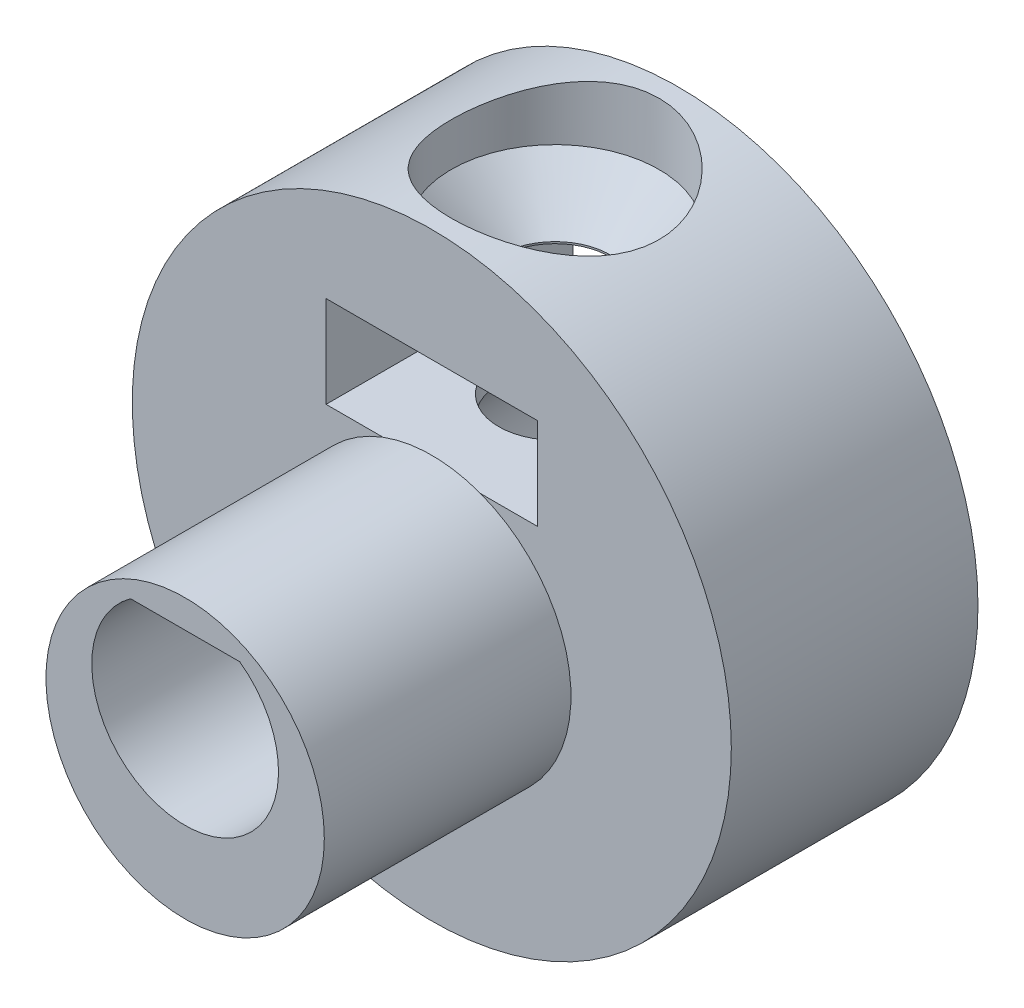
ISO-10303-21;
HEADER;
FILE_DESCRIPTION(('STEP AP214'),'2;1');
FILE_NAME('part.step','',(''),(''),'','','');
FILE_SCHEMA(('AUTOMOTIVE_DESIGN { 1 0 10303 214 1 1 1 1 }'));
ENDSEC;
DATA;
#1=APPLICATION_CONTEXT('core data for automotive mechanical design processes');
#2=APPLICATION_PROTOCOL_DEFINITION('international standard','automotive_design',2000,#1);
#3=PRODUCT_CONTEXT('',#1,'mechanical');
#4=PRODUCT('Part','Part','',(#3));
#5=PRODUCT_RELATED_PRODUCT_CATEGORY('part','',(#4));
#6=PRODUCT_DEFINITION_FORMATION('','',#4);
#7=PRODUCT_DEFINITION_CONTEXT('part definition',#1,'design');
#8=PRODUCT_DEFINITION('design','',#6,#7);
#9=PRODUCT_DEFINITION_SHAPE('','',#8);
#10=(LENGTH_UNIT() NAMED_UNIT(*) SI_UNIT(.MILLI.,.METRE.));
#11=(NAMED_UNIT(*) PLANE_ANGLE_UNIT() SI_UNIT($,.RADIAN.));
#12=(NAMED_UNIT(*) SI_UNIT($,.STERADIAN.) SOLID_ANGLE_UNIT());
#13=UNCERTAINTY_MEASURE_WITH_UNIT(LENGTH_MEASURE(1.E-05),#10,'distance_accuracy_value','');
#14=(GEOMETRIC_REPRESENTATION_CONTEXT(3) GLOBAL_UNCERTAINTY_ASSIGNED_CONTEXT((#13)) GLOBAL_UNIT_ASSIGNED_CONTEXT((#10,
#11,#12)) REPRESENTATION_CONTEXT('',''));
#15=CARTESIAN_POINT('',(0.,0.,0.));
#16=DIRECTION('',(0.,0.,1.));
#17=DIRECTION('',(1.,0.,0.));
#18=AXIS2_PLACEMENT_3D('',#15,#16,#17);
#19=CARTESIAN_POINT('',(0.,0.,7.));
#20=DIRECTION('',(0.,0.,-1.));
#21=DIRECTION('',(-1.,0.,0.));
#22=AXIS2_PLACEMENT_3D('',#19,#20,#21);
#23=CYLINDRICAL_SURFACE('',#22,8.5);
#24=CARTESIAN_POINT('',(0.,0.,7.));
#25=DIRECTION('',(0.,0.,1.));
#26=DIRECTION('',(1.,0.,0.));
#27=AXIS2_PLACEMENT_3D('',#24,#25,#26);
#28=CIRCLE('',#27,8.5);
#29=CARTESIAN_POINT('',(8.5,0.,7.));
#30=VERTEX_POINT('',#29);
#31=EDGE_CURVE('E272',#30,#30,#28,.T.);
#32=ORIENTED_EDGE('',*,*,#31,.F.);
#33=EDGE_LOOP('',(#32));
#34=FACE_BOUND('',#33,.T.);
#35=CARTESIAN_POINT('',(0.,0.,0.));
#36=DIRECTION('',(0.,0.,1.));
#37=DIRECTION('',(1.,0.,0.));
#38=AXIS2_PLACEMENT_3D('',#35,#36,#37);
#39=CIRCLE('',#38,8.5);
#40=CARTESIAN_POINT('',(8.5,0.,0.));
#41=VERTEX_POINT('',#40);
#42=EDGE_CURVE('E266',#41,#41,#39,.T.);
#43=ORIENTED_EDGE('',*,*,#42,.T.);
#44=EDGE_LOOP('',(#43));
#45=FACE_BOUND('',#44,.T.);
#46=CARTESIAN_POINT('',(-2.4976566133076,8.12475916209218,5.06978069869673));
#47=CARTESIAN_POINT('',(-2.45319115247167,8.13842624372445,5.14052214784692));
#48=CARTESIAN_POINT('',(-2.40579379129014,8.15259906685285,5.20926792787036));
#49=CARTESIAN_POINT('',(-2.30541918353998,8.18155142551015,5.34241791198123));
#50=CARTESIAN_POINT('',(-2.25244214730842,8.19633093815584,5.40682227957694));
#51=CARTESIAN_POINT('',(-2.08559993364935,8.24096387551114,5.59296340845329));
#52=CARTESIAN_POINT('',(-1.96379293821466,8.27112157248585,5.70767691704536));
#53=CARTESIAN_POINT('',(-1.70636003995567,8.32797463190604,5.91184711282402));
#54=CARTESIAN_POINT('',(-1.57128592838729,8.35474881482083,6.001981892767));
#55=CARTESIAN_POINT('',(-1.28750137103305,8.40315485018163,6.15915511575892));
#56=CARTESIAN_POINT('',(-1.13879895604352,8.42478970443847,6.22620705151039));
#57=CARTESIAN_POINT('',(-0.831187937836323,8.46068191069057,6.33519131239508));
#58=CARTESIAN_POINT('',(-0.672256571938539,8.47492212101672,6.37706530718806));
#59=CARTESIAN_POINT('',(-0.349104402202425,8.4943684291606,6.43385731899328));
#60=CARTESIAN_POINT('',(-0.184884583871302,8.49957620037078,6.44878032909372));
#61=CARTESIAN_POINT('',(0.138015723993134,8.50036011208845,6.45103621336103));
#62=CARTESIAN_POINT('',(0.296689734672785,8.4962657088658,6.43931282000832));
#63=CARTESIAN_POINT('',(0.609739891194811,8.47955195455849,6.39064304040091));
#64=CARTESIAN_POINT('',(0.764113634581695,8.46692793384153,6.35368283786199));
#65=CARTESIAN_POINT('',(1.06375533887611,8.4345186012922,6.25603150933245));
#66=CARTESIAN_POINT('',(1.20905000683216,8.41475557760322,6.19541419459285));
#67=CARTESIAN_POINT('',(1.48731375058839,8.37004774740902,6.0524065686952));
#68=CARTESIAN_POINT('',(1.62030956781964,8.34511458458429,5.97006507104002));
#69=CARTESIAN_POINT('',(1.77519124725063,8.31261821534849,5.85638504059988));
#70=CARTESIAN_POINT('',(1.8043222672237,8.30634083738567,5.83415379011479));
#71=CARTESIAN_POINT('',(1.96343933734412,8.27119610111673,5.70795471337644));
#72=CARTESIAN_POINT('',(2.08511950406867,8.24108270241644,5.59342954668651));
#73=CARTESIAN_POINT('',(2.30774596317545,8.1815459992705,5.34519120906915));
#74=CARTESIAN_POINT('',(2.40863639693148,8.15212473740542,5.2114279425932));
#75=CARTESIAN_POINT('',(2.58236776313032,8.09871823066431,4.93498995802956));
#76=CARTESIAN_POINT('',(2.65633004978303,8.07453878944836,4.79306002253415));
#77=CARTESIAN_POINT('',(2.7805092495441,8.03262664641585,4.49839769507062));
#78=CARTESIAN_POINT('',(2.83074936112862,8.01488765027596,4.34567602537025));
#79=CARTESIAN_POINT('',(2.90591996981457,7.98794413403531,4.03295557266693));
#80=CARTESIAN_POINT('',(2.9307875433104,7.97876083684202,3.87293972081594));
#81=CARTESIAN_POINT('',(2.95398174635075,7.97020434608399,3.55072336269741));
#82=CARTESIAN_POINT('',(2.95230970967962,7.97083065952385,3.38852296662646));
#83=CARTESIAN_POINT('',(2.92298994582522,7.98162544091318,3.07214390352963));
#84=CARTESIAN_POINT('',(2.89618320404268,7.9914849607523,2.91787537801917));
#85=CARTESIAN_POINT('',(2.81878881465332,8.01910824594589,2.61614548479724));
#86=CARTESIAN_POINT('',(2.76819372913322,8.03687448340477,2.46868626200185));
#87=CARTESIAN_POINT('',(2.64374182838853,8.07867559451911,2.18164089371048));
#88=CARTESIAN_POINT('',(2.56947203344734,8.10282034535183,2.04225083932772));
#89=CARTESIAN_POINT('',(2.4000811737298,8.15459461002143,1.77756977114323));
#90=CARTESIAN_POINT('',(2.30497218991925,8.18222210090779,1.65227065192168));
#91=CARTESIAN_POINT('',(2.14444672038787,8.22525010429297,1.47244158886466));
#92=CARTESIAN_POINT('',(2.08555070125962,8.24041673348502,1.41191270278541));
#93=CARTESIAN_POINT('',(1.96287977928872,8.27049513310864,1.29621000389169));
#94=CARTESIAN_POINT('',(1.89911464567286,8.28540734404793,1.24102594733433));
#95=CARTESIAN_POINT('',(1.83303027798234,8.3,1.18861513373476));
#96=B_SPLINE_CURVE_WITH_KNOTS('',3,(#46,#47,#48,#49,#50,#51,#52,#53,#54,#55,#56,#57,#58,#59,#60,
#61,#62,#63,#64,#65,#66,#67,#68,#69,#70,#71,#72,#73,#74,#75,#76,#77,#78,#79,#80,#81,#82,#83,#84,
#85,#86,#87,#88,#89,#90,#91,#92,#93,#94,#95),.UNSPECIFIED.,.F.,.F.,(4,2,2,2,2,2,2,2,2,2,2,2,2,2,
2,2,2,2,2,2,2,2,2,2,4),(0.,0.253833285787019,0.507657006239854,1.01513132403204,
1.50672343842426,1.99802771074243,2.49046585733758,2.98281276276087,3.4579950628208,
3.93343771763219,4.40740867898813,4.88032358222269,4.99186106409764,5.49853142231878,
6.00654586378571,6.48996962093975,6.9729196424049,7.45706448441352,7.94118499513888,
8.40966421544493,8.87829001289202,9.35558437726861,9.83260277159268,10.0897481621581,
10.3463905361852),.UNSPECIFIED.);
#97=CARTESIAN_POINT('',(-1.83303027798234,8.3,5.81138486626524));
#98=VERTEX_POINT('',#97);
#99=CARTESIAN_POINT('',(1.83303027798234,8.3,1.18861513373476));
#100=VERTEX_POINT('',#99);
#101=EDGE_CURVE('E187',#98,#100,#96,.T.);
#102=ORIENTED_EDGE('',*,*,#101,.F.);
#103=CARTESIAN_POINT('',(2.4976566133076,8.12475916209218,1.93021930130327));
#104=CARTESIAN_POINT('',(2.45318994500136,8.13842662563914,1.85947588226206));
#105=CARTESIAN_POINT('',(2.40579116119691,8.15259985847907,1.79072823574639));
#106=CARTESIAN_POINT('',(2.30541346555239,8.18155304169366,1.6575748509336));
#107=CARTESIAN_POINT('',(2.25243477065462,8.19633296846693,1.5931689439928));
#108=CARTESIAN_POINT('',(2.08559334134924,8.24096552582563,1.40703032681757));
#109=CARTESIAN_POINT('',(1.96378968996023,8.27112236826603,1.2923202912556));
#110=CARTESIAN_POINT('',(1.70636391719496,8.32797369967156,1.08815617097751));
#111=CARTESIAN_POINT('',(1.57129368992825,8.35474701933418,0.998023916349741));
#112=CARTESIAN_POINT('',(1.28751241618149,8.40315343701242,0.840849493137524));
#113=CARTESIAN_POINT('',(1.1388084928932,8.42478919827129,0.773795353021942));
#114=CARTESIAN_POINT('',(0.827987048637116,8.4610547714335,0.663675633520592));
#115=CARTESIAN_POINT('',(0.665639156561353,8.47551136360076,0.621199419975944));
#116=CARTESIAN_POINT('',(0.335522235240602,8.49498290962041,0.56436373105513));
#117=CARTESIAN_POINT('',(0.167753698153421,8.4999987181954,0.550001710352122));
#118=CARTESIAN_POINT('',(-0.160573090672336,8.50000122693764,0.549998362858586));
#119=CARTESIAN_POINT('',(-0.321132585567959,8.49540802765908,0.563153976514742));
#120=CARTESIAN_POINT('',(-0.637504919535551,8.47754145494676,0.615247090544994));
#121=CARTESIAN_POINT('',(-0.793317230736235,8.46426711985929,0.654187447232615));
#122=CARTESIAN_POINT('',(-1.10584501784713,8.42931993487434,0.759821744334155));
#123=CARTESIAN_POINT('',(-1.26194403527556,8.40715150324722,0.828174744399635));
#124=CARTESIAN_POINT('',(-1.55944141682563,8.35708973169379,0.990147520116793));
#125=CARTESIAN_POINT('',(-1.70083313076283,8.32919381878685,1.08377865754721));
#126=CARTESIAN_POINT('',(-1.96376574109255,8.27112897290653,1.29229244866549));
#127=CARTESIAN_POINT('',(-2.08550883931445,8.24098858276189,1.40692868073665));
#128=CARTESIAN_POINT('',(-2.30800118973862,8.1814676773007,1.65516964079898));
#129=CARTESIAN_POINT('',(-2.40875542862292,8.15208698294651,1.78876985048177));
#130=CARTESIAN_POINT('',(-2.58234889509949,8.09872513889258,2.06497202468677));
#131=CARTESIAN_POINT('',(-2.65628388776906,8.07455420965996,2.20684835983295));
#132=CARTESIAN_POINT('',(-2.78047378166719,8.03263878107992,2.50150025801988));
#133=CARTESIAN_POINT('',(-2.83073638027927,8.01489219321013,2.65427225956399));
#134=CARTESIAN_POINT('',(-2.90592304531664,7.98794314173254,2.96705492968833));
#135=CARTESIAN_POINT('',(-2.9307908841645,7.97875964189572,3.12708084544346));
#136=CARTESIAN_POINT('',(-2.95398136626459,7.9702044484857,3.44929719503748));
#137=CARTESIAN_POINT('',(-2.95230871741702,7.97083101474781,3.61148723989113));
#138=CARTESIAN_POINT('',(-2.92299011430598,7.98162538865863,3.92785476293909));
#139=CARTESIAN_POINT('',(-2.89618368313548,7.99148478657943,4.08212194506856));
#140=CARTESIAN_POINT('',(-2.81878968112678,8.01910794001413,4.38385194667557));
#141=CARTESIAN_POINT('',(-2.76819426046636,8.03687430454259,4.53131250247069));
#142=CARTESIAN_POINT('',(-2.6437418358828,8.07867559240639,4.81835909920957));
#143=CARTESIAN_POINT('',(-2.56947204541021,8.10282034150987,4.95774914059871));
#144=CARTESIAN_POINT('',(-2.40008118744198,8.1545946059138,5.22243020880838));
#145=CARTESIAN_POINT('',(-2.30497219775281,8.18222209879261,5.34772933892776));
#146=CARTESIAN_POINT('',(-2.14444664458044,8.22525012462106,5.52755849626095));
#147=CARTESIAN_POINT('',(-2.08555054227539,8.24041677442083,5.58808746070075));
#148=CARTESIAN_POINT('',(-1.96287960668323,8.27049517345836,5.70379014541685));
#149=CARTESIAN_POINT('',(-1.89911455609382,8.28540736381247,5.75897412356356));
#150=CARTESIAN_POINT('',(-1.83303027798234,8.3,5.81138486626524));
#151=B_SPLINE_CURVE_WITH_KNOTS('',3,(#103,#104,#105,#106,#107,#108,#109,#110,#111,#112,#113,
#114,#115,#116,#117,#118,#119,#120,#121,#122,#123,#124,#125,#126,#127,#128,#129,#130,#131,#132,
#133,#134,#135,#136,#137,#138,#139,#140,#141,#142,#143,#144,#145,#146,#147,#148,#149,#150),
.UNSPECIFIED.,.F.,.F.,(4,2,2,2,2,2,2,2,2,2,2,2,2,2,2,2,2,2,2,2,2,2,2,4),(0.,0.253840367119801,
0.50767086877788,1.01513136017837,1.50670724536165,1.99802774497997,2.50068775902432,
3.00330226248912,3.48440262049298,3.96555628146755,4.47840114630792,4.99147690469338,
5.49887966106123,6.00616172724637,6.48942722983445,6.97253548375081,7.45671110324845,
7.94080083792565,8.40927599969572,8.87790585615661,9.35520018446692,9.83221861486184,
10.0893643522644,10.3460063794543),.UNSPECIFIED.);
#152=EDGE_CURVE('E194',#100,#98,#151,.T.);
#153=ORIENTED_EDGE('',*,*,#152,.F.);
#154=EDGE_LOOP('',(#102,#153));
#155=FACE_BOUND('',#154,.T.);
#156=ADVANCED_FACE('F37',(#34,#45,#155),#23,.T.);
#157=CARTESIAN_POINT('',(0.,2.7,3.5));
#158=DIRECTION('',(0.,-1.,0.));
#159=DIRECTION('',(0.,0.,1.));
#160=AXIS2_PLACEMENT_3D('',#157,#158,#159);
#161=CONICAL_SURFACE('',#160,1.6,0.0174532925199433);
#162=CARTESIAN_POINT('',(0.,5.35146683778932,3.5));
#163=DIRECTION('',(0.,1.,0.));
#164=DIRECTION('',(0.,0.,1.));
#165=AXIS2_PLACEMENT_3D('',#162,#163,#164);
#166=CIRCLE('',#165,1.55371847419137);
#167=CARTESIAN_POINT('',(0.,5.35146683778932,5.05371847419137));
#168=VERTEX_POINT('',#167);
#169=EDGE_CURVE('E199',#168,#168,#166,.T.);
#170=ORIENTED_EDGE('',*,*,#169,.T.);
#171=EDGE_LOOP('',(#170));
#172=FACE_BOUND('',#171,.T.);
#173=CARTESIAN_POINT('',(0.,5.3,3.5));
#174=DIRECTION('',(0.,1.,0.));
#175=DIRECTION('',(0.,0.,1.));
#176=AXIS2_PLACEMENT_3D('',#173,#174,#175);
#177=CIRCLE('',#176,1.55461683118663);
#178=CARTESIAN_POINT('',(0.,5.3,5.05461683118663));
#179=VERTEX_POINT('',#178);
#180=EDGE_CURVE('E255',#179,#179,#177,.T.);
#181=ORIENTED_EDGE('',*,*,#180,.F.);
#182=EDGE_LOOP('',(#181));
#183=FACE_BOUND('',#182,.T.);
#184=ADVANCED_FACE('F184',(#172,#183),#161,.F.);
#185=CARTESIAN_POINT('',(0.,0.,7.));
#186=DIRECTION('',(0.,0.,1.));
#187=DIRECTION('',(1.,0.,0.));
#188=AXIS2_PLACEMENT_3D('',#185,#186,#187);
#189=PLANE('',#188);
#190=CARTESIAN_POINT('',(0.,-1.,7.));
#191=DIRECTION('',(0.,0.,1.));
#192=DIRECTION('',(1.,0.,0.));
#193=AXIS2_PLACEMENT_3D('',#190,#191,#192);
#194=CIRCLE('',#193,3.95);
#195=CARTESIAN_POINT('',(-1.38293166859393,2.7,7.));
#196=VERTEX_POINT('',#195);
#197=CARTESIAN_POINT('',(1.38293166859393,2.7,7.));
#198=VERTEX_POINT('',#197);
#199=EDGE_CURVE('E11',#196,#198,#194,.T.);
#200=ORIENTED_EDGE('',*,*,#199,.F.);
#201=DIRECTION('',(-1.,0.,0.));
#202=VECTOR('',#201,1.);
#203=CARTESIAN_POINT('',(3.,2.7,7.));
#204=LINE('',#203,#202);
#205=CARTESIAN_POINT('',(-3.,2.7,7.));
#206=VERTEX_POINT('',#205);
#207=EDGE_CURVE('E410',#196,#206,#204,.T.);
#208=ORIENTED_EDGE('',*,*,#207,.T.);
#209=DIRECTION('',(0.,1.,0.));
#210=VECTOR('',#209,1.);
#211=CARTESIAN_POINT('',(-3.,2.7,7.));
#212=LINE('',#211,#210);
#213=CARTESIAN_POINT('',(-3.,5.3,7.));
#214=VERTEX_POINT('',#213);
#215=EDGE_CURVE('E246',#206,#214,#212,.T.);
#216=ORIENTED_EDGE('',*,*,#215,.T.);
#217=DIRECTION('',(1.,0.,0.));
#218=VECTOR('',#217,1.);
#219=CARTESIAN_POINT('',(3.,5.3,7.));
#220=LINE('',#219,#218);
#221=CARTESIAN_POINT('',(3.,5.3,7.));
#222=VERTEX_POINT('',#221);
#223=EDGE_CURVE('E406',#214,#222,#220,.T.);
#224=ORIENTED_EDGE('',*,*,#223,.T.);
#225=DIRECTION('',(0.,-1.,0.));
#226=VECTOR('',#225,1.);
#227=CARTESIAN_POINT('',(3.,2.7,7.));
#228=LINE('',#227,#226);
#229=CARTESIAN_POINT('',(3.,2.7,7.));
#230=VERTEX_POINT('',#229);
#231=EDGE_CURVE('E408',#222,#230,#228,.T.);
#232=ORIENTED_EDGE('',*,*,#231,.T.);
#233=EDGE_CURVE('E261',#230,#198,#204,.T.);
#234=ORIENTED_EDGE('',*,*,#233,.T.);
#235=EDGE_LOOP('',(#200,#208,#216,#224,#232,#234));
#236=FACE_BOUND('',#235,.T.);
#237=ORIENTED_EDGE('',*,*,#31,.T.);
#238=EDGE_LOOP('',(#237));
#239=FACE_BOUND('',#238,.T.);
#240=ADVANCED_FACE('F209',(#236,#239),#189,.T.);
#241=CARTESIAN_POINT('',(0.,0.,0.));
#242=DIRECTION('',(0.,0.,1.));
#243=DIRECTION('',(1.,0.,0.));
#244=AXIS2_PLACEMENT_3D('',#241,#242,#243);
#245=PLANE('',#244);
#246=DIRECTION('',(1.,0.,0.));
#247=VECTOR('',#246,1.);
#248=CARTESIAN_POINT('',(1.54919333848297,2.15,0.));
#249=LINE('',#248,#247);
#250=CARTESIAN_POINT('',(-1.54919333848297,2.15,0.));
#251=VERTEX_POINT('',#250);
#252=CARTESIAN_POINT('',(1.54919333848297,2.15,0.));
#253=VERTEX_POINT('',#252);
#254=EDGE_CURVE('E137',#251,#253,#249,.T.);
#255=ORIENTED_EDGE('',*,*,#254,.F.);
#256=CARTESIAN_POINT('',(0.,0.,0.));
#257=DIRECTION('',(0.,0.,-1.));
#258=DIRECTION('',(-1.,0.,0.));
#259=AXIS2_PLACEMENT_3D('',#256,#257,#258);
#260=CIRCLE('',#259,2.65);
#261=EDGE_CURVE('E55',#253,#251,#260,.T.);
#262=ORIENTED_EDGE('',*,*,#261,.F.);
#263=EDGE_LOOP('',(#255,#262));
#264=FACE_BOUND('',#263,.T.);
#265=DIRECTION('',(1.,0.,0.));
#266=VECTOR('',#265,1.);
#267=CARTESIAN_POINT('',(3.,5.3,0.));
#268=LINE('',#267,#266);
#269=CARTESIAN_POINT('',(-3.,5.3,0.));
#270=VERTEX_POINT('',#269);
#271=CARTESIAN_POINT('',(3.,5.3,0.));
#272=VERTEX_POINT('',#271);
#273=EDGE_CURVE('E253',#270,#272,#268,.T.);
#274=ORIENTED_EDGE('',*,*,#273,.F.);
#275=DIRECTION('',(0.,1.,0.));
#276=VECTOR('',#275,1.);
#277=CARTESIAN_POINT('',(-3.,2.7,0.));
#278=LINE('',#277,#276);
#279=CARTESIAN_POINT('',(-3.,2.7,0.));
#280=VERTEX_POINT('',#279);
#281=EDGE_CURVE('E250',#280,#270,#278,.T.);
#282=ORIENTED_EDGE('',*,*,#281,.F.);
#283=DIRECTION('',(-1.,0.,0.));
#284=VECTOR('',#283,1.);
#285=CARTESIAN_POINT('',(3.,2.7,0.));
#286=LINE('',#285,#284);
#287=CARTESIAN_POINT('',(3.,2.7,0.));
#288=VERTEX_POINT('',#287);
#289=EDGE_CURVE('E236',#288,#280,#286,.T.);
#290=ORIENTED_EDGE('',*,*,#289,.F.);
#291=DIRECTION('',(0.,-1.,0.));
#292=VECTOR('',#291,1.);
#293=CARTESIAN_POINT('',(3.,2.7,0.));
#294=LINE('',#293,#292);
#295=EDGE_CURVE('E247',#272,#288,#294,.T.);
#296=ORIENTED_EDGE('',*,*,#295,.F.);
#297=EDGE_LOOP('',(#274,#282,#290,#296));
#298=FACE_BOUND('',#297,.T.);
#299=ORIENTED_EDGE('',*,*,#42,.F.);
#300=EDGE_LOOP('',(#299));
#301=FACE_BOUND('',#300,.T.);
#302=ADVANCED_FACE('F204',(#264,#298,#301),#245,.F.);
#303=CARTESIAN_POINT('',(-3.,2.7,7.));
#304=DIRECTION('',(-1.,0.,0.));
#305=DIRECTION('',(0.,0.,1.));
#306=AXIS2_PLACEMENT_3D('',#303,#304,#305);
#307=PLANE('',#306);
#308=ORIENTED_EDGE('',*,*,#281,.T.);
#309=DIRECTION('',(0.,0.,-1.));
#310=VECTOR('',#309,1.);
#311=CARTESIAN_POINT('',(-3.,5.3,7.));
#312=LINE('',#311,#310);
#313=EDGE_CURVE('E270',#214,#270,#312,.T.);
#314=ORIENTED_EDGE('',*,*,#313,.F.);
#315=ORIENTED_EDGE('',*,*,#215,.F.);
#316=DIRECTION('',(0.,0.,-1.));
#317=VECTOR('',#316,1.);
#318=CARTESIAN_POINT('',(-3.,2.7,7.));
#319=LINE('',#318,#317);
#320=EDGE_CURVE('E239',#206,#280,#319,.T.);
#321=ORIENTED_EDGE('',*,*,#320,.T.);
#322=EDGE_LOOP('',(#308,#314,#315,#321));
#323=FACE_BOUND('',#322,.T.);
#324=ADVANCED_FACE('F208',(#323),#307,.F.);
#325=CARTESIAN_POINT('',(3.,2.7,7.));
#326=DIRECTION('',(0.,-1.,0.));
#327=DIRECTION('',(0.,0.,-1.));
#328=AXIS2_PLACEMENT_3D('',#325,#326,#327);
#329=PLANE('',#328);
#330=CARTESIAN_POINT('',(0.,2.7,3.5));
#331=DIRECTION('',(0.,1.,0.));
#332=DIRECTION('',(0.,0.,1.));
#333=AXIS2_PLACEMENT_3D('',#330,#331,#332);
#334=CIRCLE('',#333,1.6);
#335=CARTESIAN_POINT('',(0.,2.7,5.1));
#336=VERTEX_POINT('',#335);
#337=EDGE_CURVE('E232',#336,#336,#334,.T.);
#338=ORIENTED_EDGE('',*,*,#337,.F.);
#339=EDGE_LOOP('',(#338));
#340=FACE_BOUND('',#339,.T.);
#341=ORIENTED_EDGE('',*,*,#289,.T.);
#342=ORIENTED_EDGE('',*,*,#320,.F.);
#343=ORIENTED_EDGE('',*,*,#207,.F.);
#344=EDGE_CURVE('E411',#198,#196,#204,.T.);
#345=ORIENTED_EDGE('',*,*,#344,.F.);
#346=ORIENTED_EDGE('',*,*,#233,.F.);
#347=DIRECTION('',(0.,0.,-1.));
#348=VECTOR('',#347,1.);
#349=CARTESIAN_POINT('',(3.,2.7,7.));
#350=LINE('',#349,#348);
#351=EDGE_CURVE('E242',#230,#288,#350,.T.);
#352=ORIENTED_EDGE('',*,*,#351,.T.);
#353=EDGE_LOOP('',(#341,#342,#343,#345,#346,#352));
#354=FACE_BOUND('',#353,.T.);
#355=ADVANCED_FACE('F216',(#340,#354),#329,.F.);
#356=CARTESIAN_POINT('',(3.,2.7,7.));
#357=DIRECTION('',(1.,0.,0.));
#358=DIRECTION('',(0.,0.,-1.));
#359=AXIS2_PLACEMENT_3D('',#356,#357,#358);
#360=PLANE('',#359);
#361=ORIENTED_EDGE('',*,*,#295,.T.);
#362=ORIENTED_EDGE('',*,*,#351,.F.);
#363=ORIENTED_EDGE('',*,*,#231,.F.);
#364=DIRECTION('',(0.,0.,-1.));
#365=VECTOR('',#364,1.);
#366=CARTESIAN_POINT('',(3.,5.3,7.));
#367=LINE('',#366,#365);
#368=EDGE_CURVE('E268',#222,#272,#367,.T.);
#369=ORIENTED_EDGE('',*,*,#368,.T.);
#370=EDGE_LOOP('',(#361,#362,#363,#369));
#371=FACE_BOUND('',#370,.T.);
#372=ADVANCED_FACE('F221',(#371),#360,.F.);
#373=CARTESIAN_POINT('',(3.,5.3,7.));
#374=DIRECTION('',(0.,1.,0.));
#375=DIRECTION('',(0.,0.,1.));
#376=AXIS2_PLACEMENT_3D('',#373,#374,#375);
#377=PLANE('',#376);
#378=ORIENTED_EDGE('',*,*,#180,.T.);
#379=EDGE_LOOP('',(#378));
#380=FACE_BOUND('',#379,.T.);
#381=ORIENTED_EDGE('',*,*,#273,.T.);
#382=ORIENTED_EDGE('',*,*,#368,.F.);
#383=ORIENTED_EDGE('',*,*,#223,.F.);
#384=ORIENTED_EDGE('',*,*,#313,.T.);
#385=EDGE_LOOP('',(#381,#382,#383,#384));
#386=FACE_BOUND('',#385,.T.);
#387=ADVANCED_FACE('F218',(#380,#386),#377,.F.);
#388=CARTESIAN_POINT('',(0.,2.7,3.5));
#389=DIRECTION('',(0.,1.,0.));
#390=DIRECTION('',(0.,0.,1.));
#391=AXIS2_PLACEMENT_3D('',#388,#389,#390);
#392=CONICAL_SURFACE('',#391,1.6,0.0174532925199433);
#393=CARTESIAN_POINT('',(-1.00549557480747,2.45183169264177,4.73900592127049));
#394=CARTESIAN_POINT('',(-1.04114906063982,2.43721135745625,4.70973492411046));
#395=CARTESIAN_POINT('',(-1.07542625410772,2.42224402908244,4.67901298512249));
#396=CARTESIAN_POINT('',(-1.14113413618689,2.3919911165622,4.61478896234473));
#397=CARTESIAN_POINT('',(-1.17256416605369,2.37670545976558,4.58128623858694));
#398=CARTESIAN_POINT('',(-1.26270371489511,2.33080024736449,4.47647961952857));
#399=CARTESIAN_POINT('',(-1.3169213793621,2.30027878291521,4.40115812157085));
#400=CARTESIAN_POINT('',(-1.40629379304243,2.24660375824557,4.25085287167676));
#401=CARTESIAN_POINT('',(-1.44295733493256,2.22300554787248,4.17691904176447));
#402=CARTESIAN_POINT('',(-1.50480606414261,2.18161599156685,4.02299630739797));
#403=CARTESIAN_POINT('',(-1.53002196404735,2.16380914501963,3.94302428393103));
#404=CARTESIAN_POINT('',(-1.56538722996714,2.13833561803012,3.78928784099944));
#405=CARTESIAN_POINT('',(-1.57705374091451,2.12966159914898,3.7160420403303));
#406=CARTESIAN_POINT('',(-1.59014005884272,2.11991289887216,3.56815841155053));
#407=CARTESIAN_POINT('',(-1.59157084202674,2.11883007714015,3.49352216064572));
#408=CARTESIAN_POINT('',(-1.58548333059455,2.12337948339012,3.37193606875479));
#409=CARTESIAN_POINT('',(-1.58100764763395,2.12672985034913,3.32471299614241));
#410=CARTESIAN_POINT('',(-1.56798037685201,2.13635288799468,3.23114685616058));
#411=CARTESIAN_POINT('',(-1.55942919035661,2.14262527094097,3.18480370261023));
#412=CARTESIAN_POINT('',(-1.52879158791388,2.16469903940939,3.05164292920928));
#413=CARTESIAN_POINT('',(-1.50147787835819,2.18396975180046,2.96655242033379));
#414=CARTESIAN_POINT('',(-1.43395728016035,2.228877436446,2.80330921314797));
#415=CARTESIAN_POINT('',(-1.39370771912562,2.25453541476779,2.72518058550496));
#416=CARTESIAN_POINT('',(-1.30194872073587,2.30873494744538,2.57771103157382));
#417=CARTESIAN_POINT('',(-1.25050699034981,2.33725863013626,2.50832106290542));
#418=CARTESIAN_POINT('',(-1.13729649217,2.39437899722569,2.37889254633403));
#419=CARTESIAN_POINT('',(-1.07555521978666,2.42297529276594,2.31882990155459));
#420=CARTESIAN_POINT('',(-0.973645329723348,2.46495538640708,2.23468821152848));
#421=CARTESIAN_POINT('',(-0.936852338139143,2.47921167114098,2.20689545209238));
#422=CARTESIAN_POINT('',(-0.898791632785118,2.49292470821633,2.18067432943348));
#423=B_SPLINE_CURVE_WITH_KNOTS('',3,(#393,#394,#395,#396,#397,#398,#399,#400,#401,#402,#403,
#404,#405,#406,#407,#408,#409,#410,#411,#412,#413,#414,#415,#416,#417,#418,#419,#420,#421,#422),
.UNSPECIFIED.,.F.,.F.,(4,2,2,2,2,2,2,2,2,2,2,2,2,2,4),(0.,0.145071479904694,0.290176439531789,
0.581766707980872,0.838270578911275,1.09408215532818,1.31709735954096,1.53987337923491,
1.68227071544396,1.82465403229528,2.09719464809532,2.37064370291009,2.6424823768656,
2.91360664134894,3.05822890437435),.UNSPECIFIED.);
#424=CARTESIAN_POINT('',(-1.54919333848297,2.15,3.85968215303523));
#425=VERTEX_POINT('',#424);
#426=CARTESIAN_POINT('',(-1.54919333848297,2.15,3.14031784696477));
#427=VERTEX_POINT('',#426);
#428=EDGE_CURVE('E124',#425,#427,#423,.T.);
#429=ORIENTED_EDGE('',*,*,#428,.T.);
#430=CARTESIAN_POINT('',(0.,2.15,3.5));
#431=DIRECTION('',(0.,1.,0.));
#432=DIRECTION('',(0.,0.,1.));
#433=AXIS2_PLACEMENT_3D('',#430,#431,#432);
#434=CIRCLE('',#433,1.59039971428948);
#435=CARTESIAN_POINT('',(1.54919333848297,2.15,3.14031784696477));
#436=VERTEX_POINT('',#435);
#437=EDGE_CURVE('E146',#427,#436,#434,.F.);
#438=ORIENTED_EDGE('',*,*,#437,.T.);
#439=CARTESIAN_POINT('',(0.898791632785026,2.49292470821636,2.18067432943361));
#440=CARTESIAN_POINT('',(0.936667174091869,2.47927051213931,2.20677179469448));
#441=CARTESIAN_POINT('',(0.973259453225839,2.46510033526094,2.23439898301896));
#442=CARTESIAN_POINT('',(1.04376767374676,2.43608335542143,2.29255564674331));
#443=CARTESIAN_POINT('',(1.0776838577636,2.42123661399444,2.32308485847476));
#444=CARTESIAN_POINT('',(1.17557016100806,2.37606906609189,2.41909811560865));
#445=CARTESIAN_POINT('',(1.23531890598578,2.34525629207016,2.4887590093276));
#446=CARTESIAN_POINT('',(1.33688746965532,2.28872592187343,2.63016587750862));
#447=CARTESIAN_POINT('',(1.37991409141054,2.26280912711403,2.70097533368797));
#448=CARTESIAN_POINT('',(1.45482090488903,2.21539112527075,2.84934873596978));
#449=CARTESIAN_POINT('',(1.48675047057393,2.19387053930524,2.92688079366915));
#450=CARTESIAN_POINT('',(1.52649078444639,2.16624330525176,3.05036293822033));
#451=CARTESIAN_POINT('',(1.53863568873332,2.15760350544296,3.09440326356597));
#452=CARTESIAN_POINT('',(1.56535931442556,2.13835763176975,3.21061831708121));
#453=CARTESIAN_POINT('',(1.57703147188091,2.12967844576872,3.28382997857632));
#454=CARTESIAN_POINT('',(1.59014126030158,2.11991175720869,3.43173189427637));
#455=CARTESIAN_POINT('',(1.59157347829999,2.11882826984196,3.5064229095725));
#456=CARTESIAN_POINT('',(1.58548214395148,2.12338026611942,3.6280890862294));
#457=CARTESIAN_POINT('',(1.58100449371541,2.12673176428264,3.6753374605698));
#458=CARTESIAN_POINT('',(1.56796810410584,2.13636236712984,3.7689134900266));
#459=CARTESIAN_POINT('',(1.55941459571286,2.1426377190938,3.8152422462226));
#460=CARTESIAN_POINT('',(1.54094020654753,2.1559447387288,3.89556858875685));
#461=CARTESIAN_POINT('',(1.53184205614671,2.16243213657927,3.92985371489501));
#462=CARTESIAN_POINT('',(1.50043301899892,2.18446260403059,4.03423185275902));
#463=CARTESIAN_POINT('',(1.47449693940168,2.20219390749595,4.10281478191649));
#464=CARTESIAN_POINT('',(1.41400483611516,2.24151597205148,4.23509657756863));
#465=CARTESIAN_POINT('',(1.37941774580058,2.26312056153268,4.29877673587795));
#466=CARTESIAN_POINT('',(1.29526821667221,2.3124797150711,4.43164032556896));
#467=CARTESIAN_POINT('',(1.24412065574424,2.34063391387645,4.49967528139335));
#468=CARTESIAN_POINT('',(1.13196937923128,2.39689663997294,4.62643012728681));
#469=CARTESIAN_POINT('',(1.07101505130892,2.42500471808072,4.68519391445854));
#470=CARTESIAN_POINT('',(1.00549557480747,2.45183169264177,4.73900592127049));
#471=B_SPLINE_CURVE_WITH_KNOTS('',3,(#439,#440,#441,#442,#443,#444,#445,#446,#447,#448,#449,
#450,#451,#452,#453,#454,#455,#456,#457,#458,#459,#460,#461,#462,#463,#464,#465,#466,#467,#468,
#469,#470),.UNSPECIFIED.,.F.,.F.,(4,2,2,2,2,2,2,2,2,2,2,2,2,2,2,4),(0.,0.143833004570379,
0.287652953408443,0.576648544720374,0.836182761295904,1.09454699171719,1.23385804067958,
1.45669474324779,1.67964923152965,1.82213074054759,1.96442987844758,2.07252839770362,
2.29791473700063,2.52412238271167,2.7920167906323,3.05860202213607),.UNSPECIFIED.);
#472=CARTESIAN_POINT('',(1.54919333848297,2.15,3.85968215303523));
#473=VERTEX_POINT('',#472);
#474=EDGE_CURVE('E154',#436,#473,#471,.T.);
#475=ORIENTED_EDGE('',*,*,#474,.T.);
#476=EDGE_CURVE('E143',#473,#425,#434,.F.);
#477=ORIENTED_EDGE('',*,*,#476,.T.);
#478=EDGE_LOOP('',(#429,#438,#475,#477));
#479=FACE_BOUND('',#478,.T.);
#480=ORIENTED_EDGE('',*,*,#337,.T.);
#481=EDGE_LOOP('',(#480));
#482=FACE_BOUND('',#481,.T.);
#483=ADVANCED_FACE('F160',(#479,#482),#392,.F.);
#484=CARTESIAN_POINT('',(0.,8.5,3.5));
#485=DIRECTION('',(0.,-1.,0.));
#486=DIRECTION('',(0.,0.,-1.));
#487=AXIS2_PLACEMENT_3D('',#484,#485,#486);
#488=CYLINDRICAL_SURFACE('',#487,2.95);
#489=ORIENTED_EDGE('',*,*,#101,.T.);
#490=ORIENTED_EDGE('',*,*,#152,.T.);
#491=EDGE_LOOP('',(#489,#490));
#492=FACE_BOUND('',#491,.T.);
#493=CARTESIAN_POINT('',(0.,6.74774836359798,3.5));
#494=DIRECTION('',(0.,1.,0.));
#495=DIRECTION('',(0.,0.,1.));
#496=AXIS2_PLACEMENT_3D('',#493,#494,#495);
#497=CIRCLE('',#496,2.95);
#498=CARTESIAN_POINT('',(0.,6.74774836359798,6.45));
#499=VERTEX_POINT('',#498);
#500=EDGE_CURVE('E42',#499,#499,#497,.F.);
#501=ORIENTED_EDGE('',*,*,#500,.T.);
#502=EDGE_LOOP('',(#501));
#503=FACE_BOUND('',#502,.T.);
#504=ADVANCED_FACE('F180',(#492,#503),#488,.F.);
#505=CARTESIAN_POINT('',(0.,5.35146683778934,3.5));
#506=DIRECTION('',(0.,1.,0.));
#507=DIRECTION('',(0.,0.,1.));
#508=AXIS2_PLACEMENT_3D('',#505,#506,#507);
#509=CONICAL_SURFACE('',#508,1.55371847419137,0.785398163397443);
#510=ORIENTED_EDGE('',*,*,#500,.F.);
#511=EDGE_LOOP('',(#510));
#512=FACE_BOUND('',#511,.T.);
#513=ORIENTED_EDGE('',*,*,#169,.F.);
#514=EDGE_LOOP('',(#513));
#515=FACE_BOUND('',#514,.T.);
#516=ADVANCED_FACE('F40',(#512,#515),#509,.F.);
#517=CARTESIAN_POINT('',(0.,-1.,7.));
#518=DIRECTION('',(0.,0.,1.));
#519=DIRECTION('',(1.,0.,0.));
#520=AXIS2_PLACEMENT_3D('',#517,#518,#519);
#521=PLANE('',#520);
#522=EDGE_CURVE('E48',#198,#196,#194,.T.);
#523=ORIENTED_EDGE('',*,*,#522,.F.);
#524=ORIENTED_EDGE('',*,*,#344,.T.);
#525=EDGE_LOOP('',(#523,#524));
#526=FACE_BOUND('',#525,.T.);
#527=ADVANCED_FACE('F173',(#526),#521,.F.);
#528=CARTESIAN_POINT('',(0.,-1.,14.));
#529=DIRECTION('',(0.,0.,-1.));
#530=DIRECTION('',(-1.,0.,0.));
#531=AXIS2_PLACEMENT_3D('',#528,#529,#530);
#532=CYLINDRICAL_SURFACE('',#531,3.95);
#533=CARTESIAN_POINT('',(0.,-1.,14.));
#534=DIRECTION('',(0.,0.,1.));
#535=DIRECTION('',(1.,0.,0.));
#536=AXIS2_PLACEMENT_3D('',#533,#534,#535);
#537=CIRCLE('',#536,3.95);
#538=CARTESIAN_POINT('',(3.95,-1.,14.));
#539=VERTEX_POINT('',#538);
#540=EDGE_CURVE('E400',#539,#539,#537,.T.);
#541=ORIENTED_EDGE('',*,*,#540,.F.);
#542=EDGE_LOOP('',(#541));
#543=FACE_BOUND('',#542,.T.);
#544=ORIENTED_EDGE('',*,*,#522,.T.);
#545=ORIENTED_EDGE('',*,*,#199,.T.);
#546=EDGE_LOOP('',(#544,#545));
#547=FACE_BOUND('',#546,.T.);
#548=ADVANCED_FACE('F172',(#543,#547),#532,.T.);
#549=CARTESIAN_POINT('',(0.,-1.,14.));
#550=DIRECTION('',(0.,0.,1.));
#551=DIRECTION('',(1.,0.,0.));
#552=AXIS2_PLACEMENT_3D('',#549,#550,#551);
#553=PLANE('',#552);
#554=CARTESIAN_POINT('',(0.,0.,14.));
#555=DIRECTION('',(0.,0.,-1.));
#556=DIRECTION('',(-1.,0.,0.));
#557=AXIS2_PLACEMENT_3D('',#554,#555,#556);
#558=CIRCLE('',#557,2.65);
#559=CARTESIAN_POINT('',(1.54919333848297,2.15,14.));
#560=VERTEX_POINT('',#559);
#561=CARTESIAN_POINT('',(-1.54919333848297,2.15,14.));
#562=VERTEX_POINT('',#561);
#563=EDGE_CURVE('E121',#560,#562,#558,.T.);
#564=ORIENTED_EDGE('',*,*,#563,.T.);
#565=DIRECTION('',(1.,0.,0.));
#566=VECTOR('',#565,1.);
#567=CARTESIAN_POINT('',(1.54919333848297,2.15,14.));
#568=LINE('',#567,#566);
#569=EDGE_CURVE('E130',#562,#560,#568,.T.);
#570=ORIENTED_EDGE('',*,*,#569,.T.);
#571=EDGE_LOOP('',(#564,#570));
#572=FACE_BOUND('',#571,.T.);
#573=ORIENTED_EDGE('',*,*,#540,.T.);
#574=EDGE_LOOP('',(#573));
#575=FACE_BOUND('',#574,.T.);
#576=ADVANCED_FACE('F135',(#572,#575),#553,.T.);
#577=CARTESIAN_POINT('',(0.,0.,14.));
#578=DIRECTION('',(0.,0.,-1.));
#579=DIRECTION('',(-1.,0.,0.));
#580=AXIS2_PLACEMENT_3D('',#577,#578,#579);
#581=CYLINDRICAL_SURFACE('',#580,2.65);
#582=DIRECTION('',(0.,0.,-1.));
#583=VECTOR('',#582,1.);
#584=CARTESIAN_POINT('',(1.54919333848297,2.15,14.));
#585=LINE('',#584,#583);
#586=EDGE_CURVE('E126',#436,#253,#585,.T.);
#587=ORIENTED_EDGE('',*,*,#586,.T.);
#588=ORIENTED_EDGE('',*,*,#261,.T.);
#589=DIRECTION('',(0.,0.,-1.));
#590=VECTOR('',#589,1.);
#591=CARTESIAN_POINT('',(-1.54919333848297,2.15,14.));
#592=LINE('',#591,#590);
#593=EDGE_CURVE('E127',#427,#251,#592,.T.);
#594=ORIENTED_EDGE('',*,*,#593,.F.);
#595=ORIENTED_EDGE('',*,*,#428,.F.);
#596=EDGE_CURVE('E63',#562,#425,#592,.T.);
#597=ORIENTED_EDGE('',*,*,#596,.F.);
#598=ORIENTED_EDGE('',*,*,#563,.F.);
#599=EDGE_CURVE('E132',#560,#473,#585,.T.);
#600=ORIENTED_EDGE('',*,*,#599,.T.);
#601=ORIENTED_EDGE('',*,*,#474,.F.);
#602=EDGE_LOOP('',(#587,#588,#594,#595,#597,#598,#600,#601));
#603=FACE_BOUND('',#602,.T.);
#604=ADVANCED_FACE('F118',(#603),#581,.F.);
#605=CARTESIAN_POINT('',(1.54919333848297,2.15,14.));
#606=DIRECTION('',(0.,1.,0.));
#607=DIRECTION('',(0.,0.,1.));
#608=AXIS2_PLACEMENT_3D('',#605,#606,#607);
#609=PLANE('',#608);
#610=ORIENTED_EDGE('',*,*,#593,.T.);
#611=ORIENTED_EDGE('',*,*,#254,.T.);
#612=ORIENTED_EDGE('',*,*,#586,.F.);
#613=ORIENTED_EDGE('',*,*,#437,.F.);
#614=EDGE_LOOP('',(#610,#611,#612,#613));
#615=FACE_BOUND('',#614,.T.);
#616=ADVANCED_FACE('F168',(#615),#609,.F.);
#617=ORIENTED_EDGE('',*,*,#599,.F.);
#618=ORIENTED_EDGE('',*,*,#569,.F.);
#619=ORIENTED_EDGE('',*,*,#596,.T.);
#620=ORIENTED_EDGE('',*,*,#476,.F.);
#621=EDGE_LOOP('',(#617,#618,#619,#620));
#622=FACE_BOUND('',#621,.T.);
#623=ADVANCED_FACE('F131',(#622),#609,.F.);
#624=CLOSED_SHELL('',(#156,#184,#240,#302,#324,#355,#372,#387,#483,#504,#516,#527,#548,#576,
#604,#616,#623));
#625=MANIFOLD_SOLID_BREP('B2',#624);
#626=ADVANCED_BREP_SHAPE_REPRESENTATION('',(#18,#625),#14);
#627=SHAPE_DEFINITION_REPRESENTATION(#9,#626);
ENDSEC;
END-ISO-10303-21;
